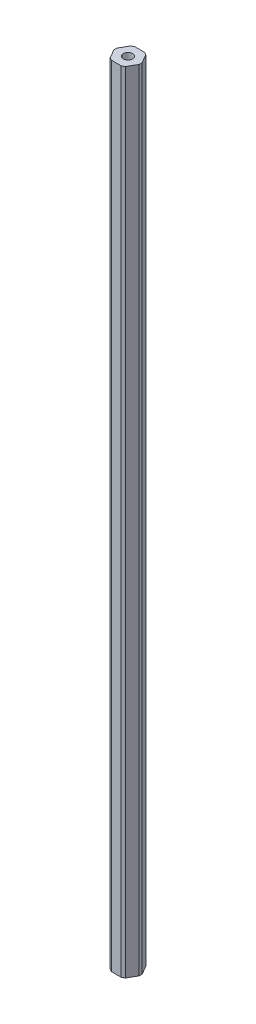
ISO-10303-21;
HEADER;
FILE_DESCRIPTION(('STEP AP214'),'2;1');
FILE_NAME('part.step','',(''),(''),'','','');
FILE_SCHEMA(('AUTOMOTIVE_DESIGN { 1 0 10303 214 1 1 1 1 }'));
ENDSEC;
DATA;
#1=APPLICATION_CONTEXT('core data for automotive mechanical design processes');
#2=APPLICATION_PROTOCOL_DEFINITION('international standard','automotive_design',2000,#1);
#3=PRODUCT_CONTEXT('',#1,'mechanical');
#4=PRODUCT('Part','Part','',(#3));
#5=PRODUCT_RELATED_PRODUCT_CATEGORY('part','',(#4));
#6=PRODUCT_DEFINITION_FORMATION('','',#4);
#7=PRODUCT_DEFINITION_CONTEXT('part definition',#1,'design');
#8=PRODUCT_DEFINITION('design','',#6,#7);
#9=PRODUCT_DEFINITION_SHAPE('','',#8);
#10=(LENGTH_UNIT() NAMED_UNIT(*) SI_UNIT(.MILLI.,.METRE.));
#11=(NAMED_UNIT(*) PLANE_ANGLE_UNIT() SI_UNIT($,.RADIAN.));
#12=(NAMED_UNIT(*) SI_UNIT($,.STERADIAN.) SOLID_ANGLE_UNIT());
#13=UNCERTAINTY_MEASURE_WITH_UNIT(LENGTH_MEASURE(1.E-05),#10,'distance_accuracy_value','');
#14=(GEOMETRIC_REPRESENTATION_CONTEXT(3) GLOBAL_UNCERTAINTY_ASSIGNED_CONTEXT((#13)) GLOBAL_UNIT_ASSIGNED_CONTEXT((#10,
#11,#12)) REPRESENTATION_CONTEXT('',''));
#15=CARTESIAN_POINT('',(0.,0.,0.));
#16=DIRECTION('',(0.,0.,1.));
#17=DIRECTION('',(1.,0.,0.));
#18=AXIS2_PLACEMENT_3D('',#15,#16,#17);
#19=CARTESIAN_POINT('',(-5.49926131403119,-428.625,-3.175));
#20=DIRECTION('',(0.866025403784439,0.,0.5));
#21=DIRECTION('',(0.5,0.,-0.866025403784439));
#22=AXIS2_PLACEMENT_3D('',#19,#20,#21);
#23=PLANE('',#22);
#24=DIRECTION('',(0.5,0.,-0.866025403784439));
#25=VECTOR('',#24,1.);
#26=CARTESIAN_POINT('',(-5.49926131403119,0.,-3.175));
#27=LINE('',#26,#25);
#28=CARTESIAN_POINT('',(-6.81675182633099,0.,-0.893039494206793));
#29=VERTEX_POINT('',#28);
#30=CARTESIAN_POINT('',(-4.18177080173138,0.,-5.45696050579321));
#31=VERTEX_POINT('',#30);
#32=EDGE_CURVE('E155',#29,#31,#27,.T.);
#33=ORIENTED_EDGE('',*,*,#32,.T.);
#34=DIRECTION('',(0.,1.,0.));
#35=VECTOR('',#34,1.);
#36=CARTESIAN_POINT('',(-4.18177080173138,-428.625,-5.45696050579321));
#37=LINE('',#36,#35);
#38=CARTESIAN_POINT('',(-4.18177080173138,-428.625,-5.45696050579321));
#39=VERTEX_POINT('',#38);
#40=EDGE_CURVE('E156',#31,#39,#37,.F.);
#41=ORIENTED_EDGE('',*,*,#40,.T.);
#42=DIRECTION('',(0.5,0.,-0.866025403784439));
#43=VECTOR('',#42,1.);
#44=CARTESIAN_POINT('',(-5.49926131403119,-428.625,-3.175));
#45=LINE('',#44,#43);
#46=CARTESIAN_POINT('',(-6.81675182633099,-428.625,-0.893039494206793));
#47=VERTEX_POINT('',#46);
#48=EDGE_CURVE('E136',#47,#39,#45,.T.);
#49=ORIENTED_EDGE('',*,*,#48,.F.);
#50=DIRECTION('',(0.,1.,0.));
#51=VECTOR('',#50,1.);
#52=CARTESIAN_POINT('',(-6.81675182633099,-428.625,-0.89303949420679));
#53=LINE('',#52,#51);
#54=EDGE_CURVE('E129',#47,#29,#53,.T.);
#55=ORIENTED_EDGE('',*,*,#54,.T.);
#56=EDGE_LOOP('',(#33,#41,#49,#55));
#57=FACE_BOUND('',#56,.T.);
#58=ADVANCED_FACE('F17',(#57),#23,.F.);
#59=CARTESIAN_POINT('',(0.,-428.625,-6.35));
#60=DIRECTION('',(0.,0.,1.));
#61=DIRECTION('',(1.,0.,0.));
#62=AXIS2_PLACEMENT_3D('',#59,#60,#61);
#63=PLANE('',#62);
#64=DIRECTION('',(1.,0.,0.));
#65=VECTOR('',#64,1.);
#66=CARTESIAN_POINT('',(0.,0.,-6.35));
#67=LINE('',#66,#65);
#68=CARTESIAN_POINT('',(-2.63498102459961,0.,-6.35));
#69=VERTEX_POINT('',#68);
#70=CARTESIAN_POINT('',(2.63498102459961,0.,-6.35));
#71=VERTEX_POINT('',#70);
#72=EDGE_CURVE('E128',#69,#71,#67,.T.);
#73=ORIENTED_EDGE('',*,*,#72,.T.);
#74=DIRECTION('',(0.,1.,0.));
#75=VECTOR('',#74,1.);
#76=CARTESIAN_POINT('',(2.63498102459962,-428.625,-6.35));
#77=LINE('',#76,#75);
#78=CARTESIAN_POINT('',(2.63498102459961,-428.625,-6.35));
#79=VERTEX_POINT('',#78);
#80=EDGE_CURVE('E110',#71,#79,#77,.F.);
#81=ORIENTED_EDGE('',*,*,#80,.T.);
#82=DIRECTION('',(1.,0.,0.));
#83=VECTOR('',#82,1.);
#84=CARTESIAN_POINT('',(0.,-428.625,-6.35));
#85=LINE('',#84,#83);
#86=CARTESIAN_POINT('',(-2.63498102459961,-428.625,-6.35));
#87=VERTEX_POINT('',#86);
#88=EDGE_CURVE('E126',#87,#79,#85,.T.);
#89=ORIENTED_EDGE('',*,*,#88,.F.);
#90=DIRECTION('',(0.,1.,0.));
#91=VECTOR('',#90,1.);
#92=CARTESIAN_POINT('',(-2.63498102459962,-428.625,-6.35));
#93=LINE('',#92,#91);
#94=EDGE_CURVE('E130',#87,#69,#93,.T.);
#95=ORIENTED_EDGE('',*,*,#94,.T.);
#96=EDGE_LOOP('',(#73,#81,#89,#95));
#97=FACE_BOUND('',#96,.T.);
#98=ADVANCED_FACE('F125',(#97),#63,.F.);
#99=CARTESIAN_POINT('',(5.49926131403119,-428.625,-3.175));
#100=DIRECTION('',(-0.866025403784439,0.,0.5));
#101=DIRECTION('',(0.5,0.,0.866025403784439));
#102=AXIS2_PLACEMENT_3D('',#99,#100,#101);
#103=PLANE('',#102);
#104=DIRECTION('',(0.5,0.,0.866025403784439));
#105=VECTOR('',#104,1.);
#106=CARTESIAN_POINT('',(5.49926131403119,0.,-3.175));
#107=LINE('',#106,#105);
#108=CARTESIAN_POINT('',(4.18177080173138,0.,-5.45696050579321));
#109=VERTEX_POINT('',#108);
#110=CARTESIAN_POINT('',(6.81675182633099,0.,-0.893039494206797));
#111=VERTEX_POINT('',#110);
#112=EDGE_CURVE('E160',#109,#111,#107,.T.);
#113=ORIENTED_EDGE('',*,*,#112,.T.);
#114=DIRECTION('',(0.,1.,0.));
#115=VECTOR('',#114,1.);
#116=CARTESIAN_POINT('',(6.81675182633099,-428.625,-0.893039494206797));
#117=LINE('',#116,#115);
#118=CARTESIAN_POINT('',(6.81675182633099,-428.625,-0.893039494206797));
#119=VERTEX_POINT('',#118);
#120=EDGE_CURVE('E184',#111,#119,#117,.F.);
#121=ORIENTED_EDGE('',*,*,#120,.T.);
#122=DIRECTION('',(0.5,0.,0.866025403784439));
#123=VECTOR('',#122,1.);
#124=CARTESIAN_POINT('',(5.49926131403119,-428.625,-3.175));
#125=LINE('',#124,#123);
#126=CARTESIAN_POINT('',(4.18177080173138,-428.625,-5.45696050579321));
#127=VERTEX_POINT('',#126);
#128=EDGE_CURVE('E135',#127,#119,#125,.T.);
#129=ORIENTED_EDGE('',*,*,#128,.F.);
#130=DIRECTION('',(0.,1.,0.));
#131=VECTOR('',#130,1.);
#132=CARTESIAN_POINT('',(4.18177080173138,-428.625,-5.45696050579321));
#133=LINE('',#132,#131);
#134=EDGE_CURVE('E113',#127,#109,#133,.T.);
#135=ORIENTED_EDGE('',*,*,#134,.T.);
#136=EDGE_LOOP('',(#113,#121,#129,#135));
#137=FACE_BOUND('',#136,.T.);
#138=ADVANCED_FACE('F231',(#137),#103,.F.);
#139=CARTESIAN_POINT('',(5.49926131403119,-428.625,3.175));
#140=DIRECTION('',(-0.866025403784439,0.,-0.5));
#141=DIRECTION('',(-0.5,0.,0.866025403784439));
#142=AXIS2_PLACEMENT_3D('',#139,#140,#141);
#143=PLANE('',#142);
#144=DIRECTION('',(-0.5,0.,0.866025403784439));
#145=VECTOR('',#144,1.);
#146=CARTESIAN_POINT('',(5.49926131403119,0.,3.175));
#147=LINE('',#146,#145);
#148=CARTESIAN_POINT('',(6.81675182633099,0.,0.893039494206778));
#149=VERTEX_POINT('',#148);
#150=CARTESIAN_POINT('',(4.18177080173137,0.,5.45696050579322));
#151=VERTEX_POINT('',#150);
#152=EDGE_CURVE('E163',#149,#151,#147,.T.);
#153=ORIENTED_EDGE('',*,*,#152,.T.);
#154=DIRECTION('',(0.,1.,0.));
#155=VECTOR('',#154,1.);
#156=CARTESIAN_POINT('',(4.18177080173137,-428.625,5.45696050579322));
#157=LINE('',#156,#155);
#158=CARTESIAN_POINT('',(4.18177080173137,-428.625,5.45696050579322));
#159=VERTEX_POINT('',#158);
#160=EDGE_CURVE('E188',#151,#159,#157,.F.);
#161=ORIENTED_EDGE('',*,*,#160,.T.);
#162=DIRECTION('',(-0.5,0.,0.866025403784439));
#163=VECTOR('',#162,1.);
#164=CARTESIAN_POINT('',(5.49926131403119,-428.625,3.175));
#165=LINE('',#164,#163);
#166=CARTESIAN_POINT('',(6.81675182633099,-428.625,0.893039494206778));
#167=VERTEX_POINT('',#166);
#168=EDGE_CURVE('E138',#167,#159,#165,.T.);
#169=ORIENTED_EDGE('',*,*,#168,.F.);
#170=DIRECTION('',(0.,1.,0.));
#171=VECTOR('',#170,1.);
#172=CARTESIAN_POINT('',(6.81675182633099,-428.625,0.893039494206778));
#173=LINE('',#172,#171);
#174=EDGE_CURVE('E191',#167,#149,#173,.T.);
#175=ORIENTED_EDGE('',*,*,#174,.T.);
#176=EDGE_LOOP('',(#153,#161,#169,#175));
#177=FACE_BOUND('',#176,.T.);
#178=ADVANCED_FACE('F227',(#177),#143,.F.);
#179=CARTESIAN_POINT('',(0.,-428.625,6.35));
#180=DIRECTION('',(0.,0.,-1.));
#181=DIRECTION('',(-1.,0.,0.));
#182=AXIS2_PLACEMENT_3D('',#179,#180,#181);
#183=PLANE('',#182);
#184=DIRECTION('',(-1.,0.,0.));
#185=VECTOR('',#184,1.);
#186=CARTESIAN_POINT('',(0.,0.,6.35));
#187=LINE('',#186,#185);
#188=CARTESIAN_POINT('',(2.63498102459961,0.,6.35));
#189=VERTEX_POINT('',#188);
#190=CARTESIAN_POINT('',(-2.63498102459961,0.,6.35));
#191=VERTEX_POINT('',#190);
#192=EDGE_CURVE('E165',#189,#191,#187,.T.);
#193=ORIENTED_EDGE('',*,*,#192,.T.);
#194=DIRECTION('',(0.,1.,0.));
#195=VECTOR('',#194,1.);
#196=CARTESIAN_POINT('',(-2.63498102459962,-428.625,6.35));
#197=LINE('',#196,#195);
#198=CARTESIAN_POINT('',(-2.63498102459961,-428.625,6.35));
#199=VERTEX_POINT('',#198);
#200=EDGE_CURVE('E194',#191,#199,#197,.F.);
#201=ORIENTED_EDGE('',*,*,#200,.T.);
#202=DIRECTION('',(-1.,0.,0.));
#203=VECTOR('',#202,1.);
#204=CARTESIAN_POINT('',(0.,-428.625,6.35));
#205=LINE('',#204,#203);
#206=CARTESIAN_POINT('',(2.63498102459961,-428.625,6.35));
#207=VERTEX_POINT('',#206);
#208=EDGE_CURVE('E146',#207,#199,#205,.T.);
#209=ORIENTED_EDGE('',*,*,#208,.F.);
#210=DIRECTION('',(0.,1.,0.));
#211=VECTOR('',#210,1.);
#212=CARTESIAN_POINT('',(2.63498102459962,-428.625,6.35));
#213=LINE('',#212,#211);
#214=EDGE_CURVE('E196',#207,#189,#213,.T.);
#215=ORIENTED_EDGE('',*,*,#214,.T.);
#216=EDGE_LOOP('',(#193,#201,#209,#215));
#217=FACE_BOUND('',#216,.T.);
#218=ADVANCED_FACE('F212',(#217),#183,.F.);
#219=CARTESIAN_POINT('',(0.,-428.625,0.));
#220=DIRECTION('',(0.,1.,0.));
#221=DIRECTION('',(0.,0.,1.));
#222=AXIS2_PLACEMENT_3D('',#219,#220,#221);
#223=CYLINDRICAL_SURFACE('',#222,2.5499949);
#224=CARTESIAN_POINT('',(0.,-428.625,0.));
#225=DIRECTION('',(0.,-1.,0.));
#226=DIRECTION('',(0.,0.,-1.));
#227=AXIS2_PLACEMENT_3D('',#224,#225,#226);
#228=CIRCLE('',#227,2.5499949);
#229=CARTESIAN_POINT('',(0.,-428.625,-2.5499949));
#230=VERTEX_POINT('',#229);
#231=EDGE_CURVE('E140',#230,#230,#228,.T.);
#232=ORIENTED_EDGE('',*,*,#231,.T.);
#233=EDGE_LOOP('',(#232));
#234=FACE_BOUND('',#233,.T.);
#235=CARTESIAN_POINT('',(0.,0.,0.));
#236=DIRECTION('',(0.,-1.,0.));
#237=DIRECTION('',(0.,0.,-1.));
#238=AXIS2_PLACEMENT_3D('',#235,#236,#237);
#239=CIRCLE('',#238,2.5499949);
#240=CARTESIAN_POINT('',(0.,0.,-2.5499949));
#241=VERTEX_POINT('',#240);
#242=EDGE_CURVE('E152',#241,#241,#239,.T.);
#243=ORIENTED_EDGE('',*,*,#242,.F.);
#244=EDGE_LOOP('',(#243));
#245=FACE_BOUND('',#244,.T.);
#246=ADVANCED_FACE('F19',(#234,#245),#223,.F.);
#247=CARTESIAN_POINT('',(-5.49926131403119,-428.625,3.175));
#248=DIRECTION('',(0.866025403784439,0.,-0.5));
#249=DIRECTION('',(-0.5,0.,-0.866025403784439));
#250=AXIS2_PLACEMENT_3D('',#247,#248,#249);
#251=PLANE('',#250);
#252=DIRECTION('',(-0.5,0.,-0.866025403784439));
#253=VECTOR('',#252,1.);
#254=CARTESIAN_POINT('',(-5.49926131403119,0.,3.175));
#255=LINE('',#254,#253);
#256=CARTESIAN_POINT('',(-4.18177080173138,0.,5.45696050579321));
#257=VERTEX_POINT('',#256);
#258=CARTESIAN_POINT('',(-6.81675182633099,0.,0.8930394942068));
#259=VERTEX_POINT('',#258);
#260=EDGE_CURVE('E21',#257,#259,#255,.T.);
#261=ORIENTED_EDGE('',*,*,#260,.T.);
#262=DIRECTION('',(0.,1.,0.));
#263=VECTOR('',#262,1.);
#264=CARTESIAN_POINT('',(-6.81675182633099,-428.625,0.893039494206803));
#265=LINE('',#264,#263);
#266=CARTESIAN_POINT('',(-6.81675182633099,-428.625,0.893039494206801));
#267=VERTEX_POINT('',#266);
#268=EDGE_CURVE('E198',#259,#267,#265,.F.);
#269=ORIENTED_EDGE('',*,*,#268,.T.);
#270=DIRECTION('',(-0.5,0.,-0.866025403784439));
#271=VECTOR('',#270,1.);
#272=CARTESIAN_POINT('',(-5.49926131403119,-428.625,3.175));
#273=LINE('',#272,#271);
#274=CARTESIAN_POINT('',(-4.18177080173138,-428.625,5.45696050579321));
#275=VERTEX_POINT('',#274);
#276=EDGE_CURVE('E149',#275,#267,#273,.T.);
#277=ORIENTED_EDGE('',*,*,#276,.F.);
#278=DIRECTION('',(0.,1.,0.));
#279=VECTOR('',#278,1.);
#280=CARTESIAN_POINT('',(-4.18177080173138,-428.625,5.45696050579321));
#281=LINE('',#280,#279);
#282=EDGE_CURVE('E118',#275,#257,#281,.T.);
#283=ORIENTED_EDGE('',*,*,#282,.T.);
#284=EDGE_LOOP('',(#261,#269,#277,#283));
#285=FACE_BOUND('',#284,.T.);
#286=ADVANCED_FACE('F255',(#285),#251,.F.);
#287=CARTESIAN_POINT('',(0.,-428.625,0.));
#288=DIRECTION('',(0.,-1.,0.));
#289=DIRECTION('',(1.,0.,0.));
#290=AXIS2_PLACEMENT_3D('',#287,#288,#289);
#291=PLANE('',#290);
#292=ORIENTED_EDGE('',*,*,#231,.F.);
#293=EDGE_LOOP('',(#292));
#294=FACE_BOUND('',#293,.T.);
#295=ORIENTED_EDGE('',*,*,#88,.T.);
#296=CARTESIAN_POINT('',(0.,-428.625,0.));
#297=DIRECTION('',(0.,-1.,0.));
#298=DIRECTION('',(0.,0.,-1.));
#299=AXIS2_PLACEMENT_3D('',#296,#297,#298);
#300=CIRCLE('',#299,6.875);
#301=EDGE_CURVE('E107',#79,#127,#300,.T.);
#302=ORIENTED_EDGE('',*,*,#301,.T.);
#303=ORIENTED_EDGE('',*,*,#128,.T.);
#304=EDGE_CURVE('E119',#119,#167,#300,.T.);
#305=ORIENTED_EDGE('',*,*,#304,.T.);
#306=ORIENTED_EDGE('',*,*,#168,.T.);
#307=EDGE_CURVE('E222',#159,#207,#300,.T.);
#308=ORIENTED_EDGE('',*,*,#307,.T.);
#309=ORIENTED_EDGE('',*,*,#208,.T.);
#310=EDGE_CURVE('E221',#199,#275,#300,.T.);
#311=ORIENTED_EDGE('',*,*,#310,.T.);
#312=ORIENTED_EDGE('',*,*,#276,.T.);
#313=EDGE_CURVE('E35',#267,#47,#300,.T.);
#314=ORIENTED_EDGE('',*,*,#313,.T.);
#315=ORIENTED_EDGE('',*,*,#48,.T.);
#316=EDGE_CURVE('E121',#39,#87,#300,.T.);
#317=ORIENTED_EDGE('',*,*,#316,.T.);
#318=EDGE_LOOP('',(#295,#302,#303,#305,#306,#308,#309,#311,#312,#314,#315,#317));
#319=FACE_BOUND('',#318,.T.);
#320=ADVANCED_FACE('F133',(#294,#319),#291,.T.);
#321=CARTESIAN_POINT('',(0.,0.,0.));
#322=DIRECTION('',(0.,-1.,0.));
#323=DIRECTION('',(1.,0.,0.));
#324=AXIS2_PLACEMENT_3D('',#321,#322,#323);
#325=PLANE('',#324);
#326=CARTESIAN_POINT('',(0.,0.,0.));
#327=DIRECTION('',(0.,-1.,0.));
#328=DIRECTION('',(0.,0.,-1.));
#329=AXIS2_PLACEMENT_3D('',#326,#327,#328);
#330=CIRCLE('',#329,6.875);
#331=EDGE_CURVE('E28',#71,#109,#330,.T.);
#332=ORIENTED_EDGE('',*,*,#331,.F.);
#333=ORIENTED_EDGE('',*,*,#72,.F.);
#334=EDGE_CURVE('E43',#31,#69,#330,.T.);
#335=ORIENTED_EDGE('',*,*,#334,.F.);
#336=ORIENTED_EDGE('',*,*,#32,.F.);
#337=EDGE_CURVE('E200',#259,#29,#330,.T.);
#338=ORIENTED_EDGE('',*,*,#337,.F.);
#339=ORIENTED_EDGE('',*,*,#260,.F.);
#340=EDGE_CURVE('E201',#191,#257,#330,.T.);
#341=ORIENTED_EDGE('',*,*,#340,.F.);
#342=ORIENTED_EDGE('',*,*,#192,.F.);
#343=EDGE_CURVE('E26',#151,#189,#330,.T.);
#344=ORIENTED_EDGE('',*,*,#343,.F.);
#345=ORIENTED_EDGE('',*,*,#152,.F.);
#346=EDGE_CURVE('E11',#111,#149,#330,.T.);
#347=ORIENTED_EDGE('',*,*,#346,.F.);
#348=ORIENTED_EDGE('',*,*,#112,.F.);
#349=EDGE_LOOP('',(#332,#333,#335,#336,#338,#339,#341,#342,#344,#345,#347,#348));
#350=FACE_BOUND('',#349,.T.);
#351=ORIENTED_EDGE('',*,*,#242,.T.);
#352=EDGE_LOOP('',(#351));
#353=FACE_BOUND('',#352,.T.);
#354=ADVANCED_FACE('F213',(#350,#353),#325,.F.);
#355=CARTESIAN_POINT('',(0.,-428.625,0.));
#356=DIRECTION('',(0.,1.,0.));
#357=DIRECTION('',(0.,0.,1.));
#358=AXIS2_PLACEMENT_3D('',#355,#356,#357);
#359=CYLINDRICAL_SURFACE('',#358,6.875);
#360=ORIENTED_EDGE('',*,*,#340,.T.);
#361=ORIENTED_EDGE('',*,*,#282,.F.);
#362=ORIENTED_EDGE('',*,*,#310,.F.);
#363=ORIENTED_EDGE('',*,*,#200,.F.);
#364=EDGE_LOOP('',(#360,#361,#362,#363));
#365=FACE_BOUND('',#364,.T.);
#366=ADVANCED_FACE('F241',(#365),#359,.T.);
#367=ORIENTED_EDGE('',*,*,#313,.F.);
#368=ORIENTED_EDGE('',*,*,#268,.F.);
#369=ORIENTED_EDGE('',*,*,#337,.T.);
#370=ORIENTED_EDGE('',*,*,#54,.F.);
#371=EDGE_LOOP('',(#367,#368,#369,#370));
#372=FACE_BOUND('',#371,.T.);
#373=ADVANCED_FACE('F218',(#372),#359,.T.);
#374=ORIENTED_EDGE('',*,*,#343,.T.);
#375=ORIENTED_EDGE('',*,*,#214,.F.);
#376=ORIENTED_EDGE('',*,*,#307,.F.);
#377=ORIENTED_EDGE('',*,*,#160,.F.);
#378=EDGE_LOOP('',(#374,#375,#376,#377));
#379=FACE_BOUND('',#378,.T.);
#380=ADVANCED_FACE('F207',(#379),#359,.T.);
#381=ORIENTED_EDGE('',*,*,#346,.T.);
#382=ORIENTED_EDGE('',*,*,#174,.F.);
#383=ORIENTED_EDGE('',*,*,#304,.F.);
#384=ORIENTED_EDGE('',*,*,#120,.F.);
#385=EDGE_LOOP('',(#381,#382,#383,#384));
#386=FACE_BOUND('',#385,.T.);
#387=ADVANCED_FACE('F232',(#386),#359,.T.);
#388=ORIENTED_EDGE('',*,*,#331,.T.);
#389=ORIENTED_EDGE('',*,*,#134,.F.);
#390=ORIENTED_EDGE('',*,*,#301,.F.);
#391=ORIENTED_EDGE('',*,*,#80,.F.);
#392=EDGE_LOOP('',(#388,#389,#390,#391));
#393=FACE_BOUND('',#392,.T.);
#394=ADVANCED_FACE('F109',(#393),#359,.T.);
#395=ORIENTED_EDGE('',*,*,#334,.T.);
#396=ORIENTED_EDGE('',*,*,#94,.F.);
#397=ORIENTED_EDGE('',*,*,#316,.F.);
#398=ORIENTED_EDGE('',*,*,#40,.F.);
#399=EDGE_LOOP('',(#395,#396,#397,#398));
#400=FACE_BOUND('',#399,.T.);
#401=ADVANCED_FACE('F240',(#400),#359,.T.);
#402=CLOSED_SHELL('',(#58,#98,#138,#178,#218,#246,#286,#320,#354,#366,#373,#380,#387,#394,#401));
#403=MANIFOLD_SOLID_BREP('B1',#402);
#404=ADVANCED_BREP_SHAPE_REPRESENTATION('',(#18,#403),#14);
#405=SHAPE_DEFINITION_REPRESENTATION(#9,#404);
ENDSEC;
END-ISO-10303-21;
